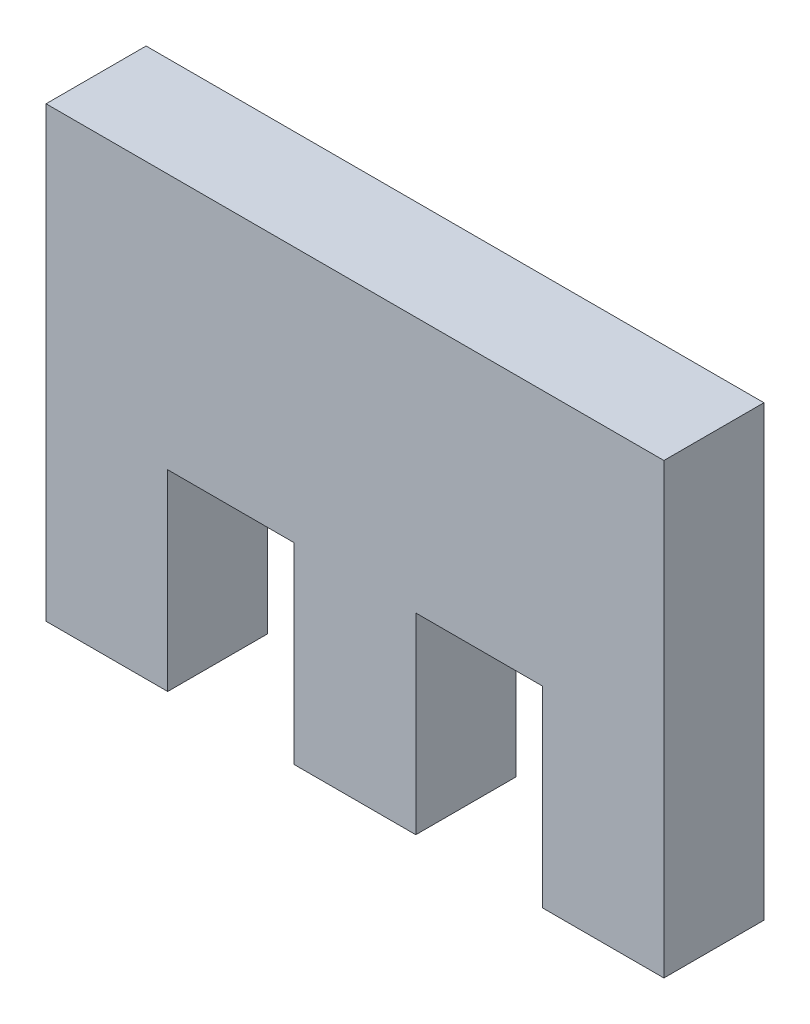
ISO-10303-21;
HEADER;
FILE_DESCRIPTION(('STEP AP214'),'2;1');
FILE_NAME('part.step','',(''),(''),'','','');
FILE_SCHEMA(('AUTOMOTIVE_DESIGN { 1 0 10303 214 1 1 1 1 }'));
ENDSEC;
DATA;
#1=APPLICATION_CONTEXT('core data for automotive mechanical design processes');
#2=APPLICATION_PROTOCOL_DEFINITION('international standard','automotive_design',2000,#1);
#3=PRODUCT_CONTEXT('',#1,'mechanical');
#4=PRODUCT('Part','Part','',(#3));
#5=PRODUCT_RELATED_PRODUCT_CATEGORY('part','',(#4));
#6=PRODUCT_DEFINITION_FORMATION('','',#4);
#7=PRODUCT_DEFINITION_CONTEXT('part definition',#1,'design');
#8=PRODUCT_DEFINITION('design','',#6,#7);
#9=PRODUCT_DEFINITION_SHAPE('','',#8);
#10=(LENGTH_UNIT() NAMED_UNIT(*) SI_UNIT(.MILLI.,.METRE.));
#11=(NAMED_UNIT(*) PLANE_ANGLE_UNIT() SI_UNIT($,.RADIAN.));
#12=(NAMED_UNIT(*) SI_UNIT($,.STERADIAN.) SOLID_ANGLE_UNIT());
#13=UNCERTAINTY_MEASURE_WITH_UNIT(LENGTH_MEASURE(1.E-05),#10,'distance_accuracy_value','');
#14=(GEOMETRIC_REPRESENTATION_CONTEXT(3) GLOBAL_UNCERTAINTY_ASSIGNED_CONTEXT((#13)) GLOBAL_UNIT_ASSIGNED_CONTEXT((#10,
#11,#12)) REPRESENTATION_CONTEXT('',''));
#15=CARTESIAN_POINT('',(0.,0.,0.));
#16=DIRECTION('',(0.,0.,1.));
#17=DIRECTION('',(1.,0.,0.));
#18=AXIS2_PLACEMENT_3D('',#15,#16,#17);
#19=CARTESIAN_POINT('',(-16.2242990654206,-3.07476635514018,3.125));
#20=DIRECTION('',(0.,1.,0.));
#21=DIRECTION('',(-1.,0.,0.));
#22=AXIS2_PLACEMENT_3D('',#19,#20,#21);
#23=PLANE('',#22);
#24=DIRECTION('',(1.,0.,0.));
#25=VECTOR('',#24,1.);
#26=CARTESIAN_POINT('',(-16.2242990654206,-3.07476635514018,0.));
#27=LINE('',#26,#25);
#28=CARTESIAN_POINT('',(-20.0242990654206,-3.07476635514018,0.));
#29=VERTEX_POINT('',#28);
#30=CARTESIAN_POINT('',(-16.2242990654206,-3.07476635514018,0.));
#31=VERTEX_POINT('',#30);
#32=EDGE_CURVE('E159',#29,#31,#27,.T.);
#33=ORIENTED_EDGE('',*,*,#32,.T.);
#34=DIRECTION('',(0.,0.,-1.));
#35=VECTOR('',#34,1.);
#36=CARTESIAN_POINT('',(-16.2242990654206,-3.07476635514018,3.125));
#37=LINE('',#36,#35);
#38=CARTESIAN_POINT('',(-16.2242990654206,-3.07476635514018,3.125));
#39=VERTEX_POINT('',#38);
#40=EDGE_CURVE('E11',#39,#31,#37,.T.);
#41=ORIENTED_EDGE('',*,*,#40,.F.);
#42=DIRECTION('',(1.,0.,0.));
#43=VECTOR('',#42,1.);
#44=CARTESIAN_POINT('',(-16.2242990654206,-3.07476635514018,3.125));
#45=LINE('',#44,#43);
#46=CARTESIAN_POINT('',(-20.0242990654206,-3.07476635514018,3.125));
#47=VERTEX_POINT('',#46);
#48=EDGE_CURVE('E181',#47,#39,#45,.T.);
#49=ORIENTED_EDGE('',*,*,#48,.F.);
#50=DIRECTION('',(0.,0.,-1.));
#51=VECTOR('',#50,1.);
#52=CARTESIAN_POINT('',(-20.0242990654206,-3.07476635514018,3.125));
#53=LINE('',#52,#51);
#54=EDGE_CURVE('E155',#47,#29,#53,.T.);
#55=ORIENTED_EDGE('',*,*,#54,.T.);
#56=EDGE_LOOP('',(#33,#41,#49,#55));
#57=FACE_BOUND('',#56,.T.);
#58=ADVANCED_FACE('F39',(#57),#23,.F.);
#59=CARTESIAN_POINT('',(-16.2242990654206,2.92523364485982,3.125));
#60=DIRECTION('',(-1.,0.,0.));
#61=DIRECTION('',(0.,0.,1.));
#62=AXIS2_PLACEMENT_3D('',#59,#60,#61);
#63=PLANE('',#62);
#64=DIRECTION('',(0.,1.,0.));
#65=VECTOR('',#64,1.);
#66=CARTESIAN_POINT('',(-16.2242990654206,2.92523364485982,0.));
#67=LINE('',#66,#65);
#68=CARTESIAN_POINT('',(-16.2242990654206,2.92523364485982,0.));
#69=VERTEX_POINT('',#68);
#70=EDGE_CURVE('E162',#31,#69,#67,.T.);
#71=ORIENTED_EDGE('',*,*,#70,.T.);
#72=DIRECTION('',(0.,0.,-1.));
#73=VECTOR('',#72,1.);
#74=CARTESIAN_POINT('',(-16.2242990654206,2.92523364485982,3.125));
#75=LINE('',#74,#73);
#76=CARTESIAN_POINT('',(-16.2242990654206,2.92523364485982,3.125));
#77=VERTEX_POINT('',#76);
#78=EDGE_CURVE('E47',#77,#69,#75,.T.);
#79=ORIENTED_EDGE('',*,*,#78,.F.);
#80=DIRECTION('',(0.,1.,0.));
#81=VECTOR('',#80,1.);
#82=CARTESIAN_POINT('',(-16.2242990654206,2.92523364485982,3.125));
#83=LINE('',#82,#81);
#84=EDGE_CURVE('E110',#39,#77,#83,.T.);
#85=ORIENTED_EDGE('',*,*,#84,.F.);
#86=ORIENTED_EDGE('',*,*,#40,.T.);
#87=EDGE_LOOP('',(#71,#79,#85,#86));
#88=FACE_BOUND('',#87,.T.);
#89=ADVANCED_FACE('F259',(#88),#63,.F.);
#90=CARTESIAN_POINT('',(-12.2742990654206,2.92523364485982,3.125));
#91=DIRECTION('',(0.,1.,0.));
#92=DIRECTION('',(-1.,0.,0.));
#93=AXIS2_PLACEMENT_3D('',#90,#91,#92);
#94=PLANE('',#93);
#95=DIRECTION('',(1.,0.,0.));
#96=VECTOR('',#95,1.);
#97=CARTESIAN_POINT('',(-12.2742990654206,2.92523364485982,0.));
#98=LINE('',#97,#96);
#99=CARTESIAN_POINT('',(-12.2742990654206,2.92523364485982,0.));
#100=VERTEX_POINT('',#99);
#101=EDGE_CURVE('E164',#69,#100,#98,.T.);
#102=ORIENTED_EDGE('',*,*,#101,.T.);
#103=DIRECTION('',(0.,0.,-1.));
#104=VECTOR('',#103,1.);
#105=CARTESIAN_POINT('',(-12.2742990654206,2.92523364485982,3.125));
#106=LINE('',#105,#104);
#107=CARTESIAN_POINT('',(-12.2742990654206,2.92523364485982,3.125));
#108=VERTEX_POINT('',#107);
#109=EDGE_CURVE('E200',#108,#100,#106,.T.);
#110=ORIENTED_EDGE('',*,*,#109,.F.);
#111=DIRECTION('',(1.,0.,0.));
#112=VECTOR('',#111,1.);
#113=CARTESIAN_POINT('',(-12.2742990654206,2.92523364485982,3.125));
#114=LINE('',#113,#112);
#115=EDGE_CURVE('E208',#77,#108,#114,.T.);
#116=ORIENTED_EDGE('',*,*,#115,.F.);
#117=ORIENTED_EDGE('',*,*,#78,.T.);
#118=EDGE_LOOP('',(#102,#110,#116,#117));
#119=FACE_BOUND('',#118,.T.);
#120=ADVANCED_FACE('F206',(#119),#94,.F.);
#121=CARTESIAN_POINT('',(-12.2742990654206,-3.07476635514018,3.125));
#122=DIRECTION('',(1.,0.,0.));
#123=DIRECTION('',(0.,0.,-1.));
#124=AXIS2_PLACEMENT_3D('',#121,#122,#123);
#125=PLANE('',#124);
#126=DIRECTION('',(0.,-1.,0.));
#127=VECTOR('',#126,1.);
#128=CARTESIAN_POINT('',(-12.2742990654206,-3.07476635514018,0.));
#129=LINE('',#128,#127);
#130=CARTESIAN_POINT('',(-12.2742990654206,-3.07476635514018,0.));
#131=VERTEX_POINT('',#130);
#132=EDGE_CURVE('E166',#100,#131,#129,.T.);
#133=ORIENTED_EDGE('',*,*,#132,.T.);
#134=DIRECTION('',(0.,0.,-1.));
#135=VECTOR('',#134,1.);
#136=CARTESIAN_POINT('',(-12.2742990654206,-3.07476635514018,3.125));
#137=LINE('',#136,#135);
#138=CARTESIAN_POINT('',(-12.2742990654206,-3.07476635514018,3.125));
#139=VERTEX_POINT('',#138);
#140=EDGE_CURVE('E197',#139,#131,#137,.T.);
#141=ORIENTED_EDGE('',*,*,#140,.F.);
#142=DIRECTION('',(0.,-1.,0.));
#143=VECTOR('',#142,1.);
#144=CARTESIAN_POINT('',(-12.2742990654206,-3.07476635514018,3.125));
#145=LINE('',#144,#143);
#146=EDGE_CURVE('E226',#108,#139,#145,.T.);
#147=ORIENTED_EDGE('',*,*,#146,.F.);
#148=ORIENTED_EDGE('',*,*,#109,.T.);
#149=EDGE_LOOP('',(#133,#141,#147,#148));
#150=FACE_BOUND('',#149,.T.);
#151=ADVANCED_FACE('F217',(#150),#125,.F.);
#152=CARTESIAN_POINT('',(-8.47429906542057,-3.07476635514018,3.125));
#153=DIRECTION('',(0.,1.,0.));
#154=DIRECTION('',(0.,0.,1.));
#155=AXIS2_PLACEMENT_3D('',#152,#153,#154);
#156=PLANE('',#155);
#157=DIRECTION('',(1.,0.,0.));
#158=VECTOR('',#157,1.);
#159=CARTESIAN_POINT('',(-8.47429906542057,-3.07476635514018,0.));
#160=LINE('',#159,#158);
#161=CARTESIAN_POINT('',(-8.47429906542057,-3.07476635514018,0.));
#162=VERTEX_POINT('',#161);
#163=EDGE_CURVE('E168',#131,#162,#160,.T.);
#164=ORIENTED_EDGE('',*,*,#163,.T.);
#165=DIRECTION('',(0.,0.,-1.));
#166=VECTOR('',#165,1.);
#167=CARTESIAN_POINT('',(-8.47429906542057,-3.07476635514018,3.125));
#168=LINE('',#167,#166);
#169=CARTESIAN_POINT('',(-8.47429906542057,-3.07476635514018,3.125));
#170=VERTEX_POINT('',#169);
#171=EDGE_CURVE('E194',#170,#162,#168,.T.);
#172=ORIENTED_EDGE('',*,*,#171,.F.);
#173=DIRECTION('',(1.,0.,0.));
#174=VECTOR('',#173,1.);
#175=CARTESIAN_POINT('',(-8.47429906542057,-3.07476635514018,3.125));
#176=LINE('',#175,#174);
#177=EDGE_CURVE('E223',#139,#170,#176,.T.);
#178=ORIENTED_EDGE('',*,*,#177,.F.);
#179=ORIENTED_EDGE('',*,*,#140,.T.);
#180=EDGE_LOOP('',(#164,#172,#178,#179));
#181=FACE_BOUND('',#180,.T.);
#182=ADVANCED_FACE('F221',(#181),#156,.F.);
#183=CARTESIAN_POINT('',(-8.47429906542057,2.92523364485981,3.125));
#184=DIRECTION('',(-1.,0.,0.));
#185=DIRECTION('',(0.,0.,1.));
#186=AXIS2_PLACEMENT_3D('',#183,#184,#185);
#187=PLANE('',#186);
#188=DIRECTION('',(0.,1.,0.));
#189=VECTOR('',#188,1.);
#190=CARTESIAN_POINT('',(-8.47429906542057,2.92523364485981,0.));
#191=LINE('',#190,#189);
#192=CARTESIAN_POINT('',(-8.47429906542057,2.92523364485981,0.));
#193=VERTEX_POINT('',#192);
#194=EDGE_CURVE('E170',#162,#193,#191,.T.);
#195=ORIENTED_EDGE('',*,*,#194,.T.);
#196=DIRECTION('',(0.,0.,-1.));
#197=VECTOR('',#196,1.);
#198=CARTESIAN_POINT('',(-8.47429906542057,2.92523364485981,3.125));
#199=LINE('',#198,#197);
#200=CARTESIAN_POINT('',(-8.47429906542057,2.92523364485981,3.125));
#201=VERTEX_POINT('',#200);
#202=EDGE_CURVE('E191',#201,#193,#199,.T.);
#203=ORIENTED_EDGE('',*,*,#202,.F.);
#204=DIRECTION('',(0.,1.,0.));
#205=VECTOR('',#204,1.);
#206=CARTESIAN_POINT('',(-8.47429906542057,2.92523364485981,3.125));
#207=LINE('',#206,#205);
#208=EDGE_CURVE('E225',#170,#201,#207,.T.);
#209=ORIENTED_EDGE('',*,*,#208,.F.);
#210=ORIENTED_EDGE('',*,*,#171,.T.);
#211=EDGE_LOOP('',(#195,#203,#209,#210));
#212=FACE_BOUND('',#211,.T.);
#213=ADVANCED_FACE('F272',(#212),#187,.F.);
#214=CARTESIAN_POINT('',(-4.52429906542057,2.92523364485981,3.125));
#215=DIRECTION('',(0.,1.,0.));
#216=DIRECTION('',(-1.,0.,0.));
#217=AXIS2_PLACEMENT_3D('',#214,#215,#216);
#218=PLANE('',#217);
#219=DIRECTION('',(1.,0.,0.));
#220=VECTOR('',#219,1.);
#221=CARTESIAN_POINT('',(-4.52429906542057,2.92523364485981,0.));
#222=LINE('',#221,#220);
#223=CARTESIAN_POINT('',(-4.52429906542057,2.92523364485981,0.));
#224=VERTEX_POINT('',#223);
#225=EDGE_CURVE('E172',#193,#224,#222,.T.);
#226=ORIENTED_EDGE('',*,*,#225,.T.);
#227=DIRECTION('',(0.,0.,-1.));
#228=VECTOR('',#227,1.);
#229=CARTESIAN_POINT('',(-4.52429906542057,2.92523364485981,3.125));
#230=LINE('',#229,#228);
#231=CARTESIAN_POINT('',(-4.52429906542057,2.92523364485981,3.125));
#232=VERTEX_POINT('',#231);
#233=EDGE_CURVE('E188',#232,#224,#230,.T.);
#234=ORIENTED_EDGE('',*,*,#233,.F.);
#235=DIRECTION('',(1.,0.,0.));
#236=VECTOR('',#235,1.);
#237=CARTESIAN_POINT('',(-4.52429906542057,2.92523364485981,3.125));
#238=LINE('',#237,#236);
#239=EDGE_CURVE('E228',#201,#232,#238,.T.);
#240=ORIENTED_EDGE('',*,*,#239,.F.);
#241=ORIENTED_EDGE('',*,*,#202,.T.);
#242=EDGE_LOOP('',(#226,#234,#240,#241));
#243=FACE_BOUND('',#242,.T.);
#244=ADVANCED_FACE('F275',(#243),#218,.F.);
#245=CARTESIAN_POINT('',(-4.52429906542057,-3.07476635514019,3.125));
#246=DIRECTION('',(1.,0.,0.));
#247=DIRECTION('',(0.,0.,-1.));
#248=AXIS2_PLACEMENT_3D('',#245,#246,#247);
#249=PLANE('',#248);
#250=DIRECTION('',(0.,-1.,0.));
#251=VECTOR('',#250,1.);
#252=CARTESIAN_POINT('',(-4.52429906542057,-3.07476635514019,0.));
#253=LINE('',#252,#251);
#254=CARTESIAN_POINT('',(-4.52429906542057,-3.07476635514019,0.));
#255=VERTEX_POINT('',#254);
#256=EDGE_CURVE('E174',#224,#255,#253,.T.);
#257=ORIENTED_EDGE('',*,*,#256,.T.);
#258=DIRECTION('',(0.,0.,-1.));
#259=VECTOR('',#258,1.);
#260=CARTESIAN_POINT('',(-4.52429906542057,-3.07476635514019,3.125));
#261=LINE('',#260,#259);
#262=CARTESIAN_POINT('',(-4.52429906542057,-3.07476635514019,3.125));
#263=VERTEX_POINT('',#262);
#264=EDGE_CURVE('E185',#263,#255,#261,.T.);
#265=ORIENTED_EDGE('',*,*,#264,.F.);
#266=DIRECTION('',(0.,-1.,0.));
#267=VECTOR('',#266,1.);
#268=CARTESIAN_POINT('',(-4.52429906542057,-3.07476635514019,3.125));
#269=LINE('',#268,#267);
#270=EDGE_CURVE('E234',#232,#263,#269,.T.);
#271=ORIENTED_EDGE('',*,*,#270,.F.);
#272=ORIENTED_EDGE('',*,*,#233,.T.);
#273=EDGE_LOOP('',(#257,#265,#271,#272));
#274=FACE_BOUND('',#273,.T.);
#275=ADVANCED_FACE('F240',(#274),#249,.F.);
#276=CARTESIAN_POINT('',(-0.724299065420573,-3.07476635514019,3.125));
#277=DIRECTION('',(0.,1.,0.));
#278=DIRECTION('',(-1.,0.,0.));
#279=AXIS2_PLACEMENT_3D('',#276,#277,#278);
#280=PLANE('',#279);
#281=DIRECTION('',(1.,0.,0.));
#282=VECTOR('',#281,1.);
#283=CARTESIAN_POINT('',(-0.724299065420573,-3.07476635514019,0.));
#284=LINE('',#283,#282);
#285=CARTESIAN_POINT('',(-0.724299065420573,-3.07476635514019,0.));
#286=VERTEX_POINT('',#285);
#287=EDGE_CURVE('E176',#255,#286,#284,.T.);
#288=ORIENTED_EDGE('',*,*,#287,.T.);
#289=DIRECTION('',(0.,0.,-1.));
#290=VECTOR('',#289,1.);
#291=CARTESIAN_POINT('',(-0.724299065420573,-3.07476635514019,3.125));
#292=LINE('',#291,#290);
#293=CARTESIAN_POINT('',(-0.724299065420573,-3.07476635514019,3.125));
#294=VERTEX_POINT('',#293);
#295=EDGE_CURVE('E150',#294,#286,#292,.T.);
#296=ORIENTED_EDGE('',*,*,#295,.F.);
#297=DIRECTION('',(1.,0.,0.));
#298=VECTOR('',#297,1.);
#299=CARTESIAN_POINT('',(-0.724299065420573,-3.07476635514019,3.125));
#300=LINE('',#299,#298);
#301=EDGE_CURVE('E141',#263,#294,#300,.T.);
#302=ORIENTED_EDGE('',*,*,#301,.F.);
#303=ORIENTED_EDGE('',*,*,#264,.T.);
#304=EDGE_LOOP('',(#288,#296,#302,#303));
#305=FACE_BOUND('',#304,.T.);
#306=ADVANCED_FACE('F244',(#305),#280,.F.);
#307=CARTESIAN_POINT('',(-0.724299065420575,10.9252336448598,3.125));
#308=DIRECTION('',(-1.,0.,0.));
#309=DIRECTION('',(0.,-1.,0.));
#310=AXIS2_PLACEMENT_3D('',#307,#308,#309);
#311=PLANE('',#310);
#312=DIRECTION('',(0.,1.,0.));
#313=VECTOR('',#312,1.);
#314=CARTESIAN_POINT('',(-0.724299065420575,10.9252336448598,0.));
#315=LINE('',#314,#313);
#316=CARTESIAN_POINT('',(-0.724299065420575,10.9252336448598,0.));
#317=VERTEX_POINT('',#316);
#318=EDGE_CURVE('E149',#286,#317,#315,.T.);
#319=ORIENTED_EDGE('',*,*,#318,.T.);
#320=DIRECTION('',(0.,0.,-1.));
#321=VECTOR('',#320,1.);
#322=CARTESIAN_POINT('',(-0.724299065420575,10.9252336448598,3.125));
#323=LINE('',#322,#321);
#324=CARTESIAN_POINT('',(-0.724299065420575,10.9252336448598,3.125));
#325=VERTEX_POINT('',#324);
#326=EDGE_CURVE('E146',#325,#317,#323,.T.);
#327=ORIENTED_EDGE('',*,*,#326,.F.);
#328=DIRECTION('',(0.,1.,0.));
#329=VECTOR('',#328,1.);
#330=CARTESIAN_POINT('',(-0.724299065420575,10.9252336448598,3.125));
#331=LINE('',#330,#329);
#332=EDGE_CURVE('E135',#294,#325,#331,.T.);
#333=ORIENTED_EDGE('',*,*,#332,.F.);
#334=ORIENTED_EDGE('',*,*,#295,.T.);
#335=EDGE_LOOP('',(#319,#327,#333,#334));
#336=FACE_BOUND('',#335,.T.);
#337=ADVANCED_FACE('F147',(#336),#311,.F.);
#338=CARTESIAN_POINT('',(-20.0242990654206,10.9252336448598,3.125));
#339=DIRECTION('',(0.,-1.,0.));
#340=DIRECTION('',(0.,0.,-1.));
#341=AXIS2_PLACEMENT_3D('',#338,#339,#340);
#342=PLANE('',#341);
#343=DIRECTION('',(-1.,0.,0.));
#344=VECTOR('',#343,1.);
#345=CARTESIAN_POINT('',(-20.0242990654206,10.9252336448598,0.));
#346=LINE('',#345,#344);
#347=CARTESIAN_POINT('',(-20.0242990654206,10.9252336448598,0.));
#348=VERTEX_POINT('',#347);
#349=EDGE_CURVE('E96',#317,#348,#346,.T.);
#350=ORIENTED_EDGE('',*,*,#349,.T.);
#351=DIRECTION('',(0.,0.,-1.));
#352=VECTOR('',#351,1.);
#353=CARTESIAN_POINT('',(-20.0242990654206,10.9252336448598,3.125));
#354=LINE('',#353,#352);
#355=CARTESIAN_POINT('',(-20.0242990654206,10.9252336448598,3.125));
#356=VERTEX_POINT('',#355);
#357=EDGE_CURVE('E151',#356,#348,#354,.T.);
#358=ORIENTED_EDGE('',*,*,#357,.F.);
#359=DIRECTION('',(-1.,0.,0.));
#360=VECTOR('',#359,1.);
#361=CARTESIAN_POINT('',(-20.0242990654206,10.9252336448598,3.125));
#362=LINE('',#361,#360);
#363=EDGE_CURVE('E139',#325,#356,#362,.T.);
#364=ORIENTED_EDGE('',*,*,#363,.F.);
#365=ORIENTED_EDGE('',*,*,#326,.T.);
#366=EDGE_LOOP('',(#350,#358,#364,#365));
#367=FACE_BOUND('',#366,.T.);
#368=ADVANCED_FACE('F153',(#367),#342,.F.);
#369=CARTESIAN_POINT('',(-20.0242990654206,-3.07476635514018,3.125));
#370=DIRECTION('',(1.,0.,0.));
#371=DIRECTION('',(0.,0.,-1.));
#372=AXIS2_PLACEMENT_3D('',#369,#370,#371);
#373=PLANE('',#372);
#374=DIRECTION('',(0.,-1.,0.));
#375=VECTOR('',#374,1.);
#376=CARTESIAN_POINT('',(-20.0242990654206,-3.07476635514018,0.));
#377=LINE('',#376,#375);
#378=EDGE_CURVE('E102',#348,#29,#377,.T.);
#379=ORIENTED_EDGE('',*,*,#378,.T.);
#380=ORIENTED_EDGE('',*,*,#54,.F.);
#381=DIRECTION('',(0.,-1.,0.));
#382=VECTOR('',#381,1.);
#383=CARTESIAN_POINT('',(-20.0242990654206,-3.07476635514018,3.125));
#384=LINE('',#383,#382);
#385=EDGE_CURVE('E55',#356,#47,#384,.T.);
#386=ORIENTED_EDGE('',*,*,#385,.F.);
#387=ORIENTED_EDGE('',*,*,#357,.T.);
#388=EDGE_LOOP('',(#379,#380,#386,#387));
#389=FACE_BOUND('',#388,.T.);
#390=ADVANCED_FACE('F248',(#389),#373,.F.);
#391=CARTESIAN_POINT('',(0.,0.,3.125));
#392=DIRECTION('',(0.,0.,-1.));
#393=DIRECTION('',(-1.,0.,0.));
#394=AXIS2_PLACEMENT_3D('',#391,#392,#393);
#395=PLANE('',#394);
#396=ORIENTED_EDGE('',*,*,#48,.T.);
#397=ORIENTED_EDGE('',*,*,#84,.T.);
#398=ORIENTED_EDGE('',*,*,#115,.T.);
#399=ORIENTED_EDGE('',*,*,#146,.T.);
#400=ORIENTED_EDGE('',*,*,#177,.T.);
#401=ORIENTED_EDGE('',*,*,#208,.T.);
#402=ORIENTED_EDGE('',*,*,#239,.T.);
#403=ORIENTED_EDGE('',*,*,#270,.T.);
#404=ORIENTED_EDGE('',*,*,#301,.T.);
#405=ORIENTED_EDGE('',*,*,#332,.T.);
#406=ORIENTED_EDGE('',*,*,#363,.T.);
#407=ORIENTED_EDGE('',*,*,#385,.T.);
#408=EDGE_LOOP('',(#396,#397,#398,#399,#400,#401,#402,#403,#404,#405,#406,#407));
#409=FACE_BOUND('',#408,.T.);
#410=ADVANCED_FACE('F137',(#409),#395,.F.);
#411=CARTESIAN_POINT('',(0.,0.,0.));
#412=DIRECTION('',(0.,0.,-1.));
#413=DIRECTION('',(-1.,0.,0.));
#414=AXIS2_PLACEMENT_3D('',#411,#412,#413);
#415=PLANE('',#414);
#416=ORIENTED_EDGE('',*,*,#32,.F.);
#417=ORIENTED_EDGE('',*,*,#378,.F.);
#418=ORIENTED_EDGE('',*,*,#349,.F.);
#419=ORIENTED_EDGE('',*,*,#318,.F.);
#420=ORIENTED_EDGE('',*,*,#287,.F.);
#421=ORIENTED_EDGE('',*,*,#256,.F.);
#422=ORIENTED_EDGE('',*,*,#225,.F.);
#423=ORIENTED_EDGE('',*,*,#194,.F.);
#424=ORIENTED_EDGE('',*,*,#163,.F.);
#425=ORIENTED_EDGE('',*,*,#132,.F.);
#426=ORIENTED_EDGE('',*,*,#101,.F.);
#427=ORIENTED_EDGE('',*,*,#70,.F.);
#428=EDGE_LOOP('',(#416,#417,#418,#419,#420,#421,#422,#423,#424,#425,#426,#427));
#429=FACE_BOUND('',#428,.T.);
#430=ADVANCED_FACE('F212',(#429),#415,.T.);
#431=CLOSED_SHELL('',(#58,#89,#120,#151,#182,#213,#244,#275,#306,#337,#368,#390,#410,#430));
#432=MANIFOLD_SOLID_BREP('B2',#431);
#433=ADVANCED_BREP_SHAPE_REPRESENTATION('',(#18,#432),#14);
#434=SHAPE_DEFINITION_REPRESENTATION(#9,#433);
ENDSEC;
END-ISO-10303-21;
